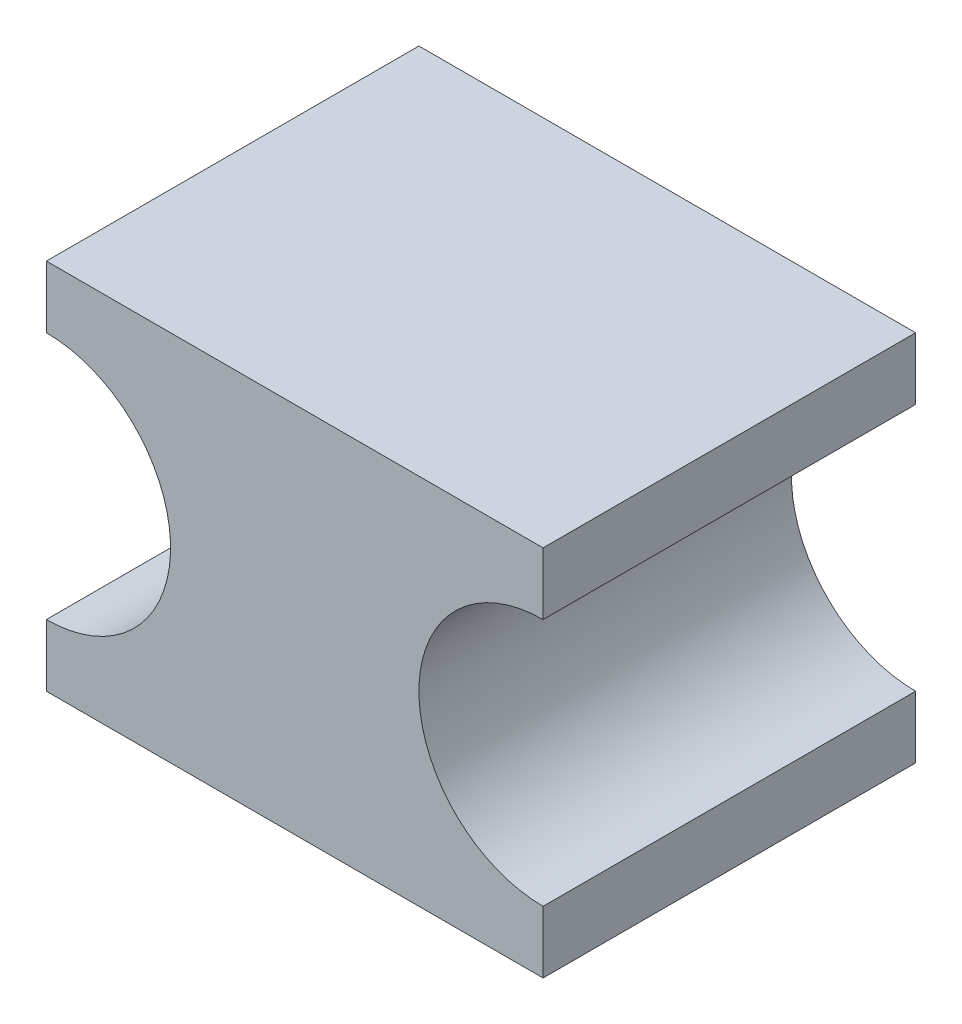
ISO-10303-21;
HEADER;
FILE_DESCRIPTION(('STEP AP214'),'2;1');
FILE_NAME('part.step','',(''),(''),'','','');
FILE_SCHEMA(('AUTOMOTIVE_DESIGN { 1 0 10303 214 1 1 1 1 }'));
ENDSEC;
DATA;
#1=APPLICATION_CONTEXT('core data for automotive mechanical design processes');
#2=APPLICATION_PROTOCOL_DEFINITION('international standard','automotive_design',2000,#1);
#3=PRODUCT_CONTEXT('',#1,'mechanical');
#4=PRODUCT('Part','Part','',(#3));
#5=PRODUCT_RELATED_PRODUCT_CATEGORY('part','',(#4));
#6=PRODUCT_DEFINITION_FORMATION('','',#4);
#7=PRODUCT_DEFINITION_CONTEXT('part definition',#1,'design');
#8=PRODUCT_DEFINITION('design','',#6,#7);
#9=PRODUCT_DEFINITION_SHAPE('','',#8);
#10=(LENGTH_UNIT() NAMED_UNIT(*) SI_UNIT(.MILLI.,.METRE.));
#11=(NAMED_UNIT(*) PLANE_ANGLE_UNIT() SI_UNIT($,.RADIAN.));
#12=(NAMED_UNIT(*) SI_UNIT($,.STERADIAN.) SOLID_ANGLE_UNIT());
#13=UNCERTAINTY_MEASURE_WITH_UNIT(LENGTH_MEASURE(1.E-05),#10,'distance_accuracy_value','');
#14=(GEOMETRIC_REPRESENTATION_CONTEXT(3) GLOBAL_UNCERTAINTY_ASSIGNED_CONTEXT((#13)) GLOBAL_UNIT_ASSIGNED_CONTEXT((#10,
#11,#12)) REPRESENTATION_CONTEXT('',''));
#15=CARTESIAN_POINT('',(0.,0.,0.));
#16=DIRECTION('',(0.,0.,1.));
#17=DIRECTION('',(1.,0.,0.));
#18=AXIS2_PLACEMENT_3D('',#15,#16,#17);
#19=CARTESIAN_POINT('',(0.,38.1,0.));
#20=DIRECTION('',(1.,0.,0.));
#21=DIRECTION('',(0.,0.,-1.));
#22=AXIS2_PLACEMENT_3D('',#19,#20,#21);
#23=PLANE('',#22);
#24=DIRECTION('',(0.,-1.,0.));
#25=VECTOR('',#24,1.);
#26=CARTESIAN_POINT('',(0.,38.1,-38.1));
#27=LINE('',#26,#25);
#28=CARTESIAN_POINT('',(0.,38.1,-38.1));
#29=VERTEX_POINT('',#28);
#30=CARTESIAN_POINT('',(0.,31.75,-38.1));
#31=VERTEX_POINT('',#30);
#32=EDGE_CURVE('E127',#29,#31,#27,.T.);
#33=ORIENTED_EDGE('',*,*,#32,.T.);
#34=DIRECTION('',(0.,0.,1.));
#35=VECTOR('',#34,1.);
#36=CARTESIAN_POINT('',(0.,31.75,-38.1));
#37=LINE('',#36,#35);
#38=CARTESIAN_POINT('',(0.,31.75,0.));
#39=VERTEX_POINT('',#38);
#40=EDGE_CURVE('E60',#31,#39,#37,.T.);
#41=ORIENTED_EDGE('',*,*,#40,.T.);
#42=DIRECTION('',(0.,-1.,0.));
#43=VECTOR('',#42,1.);
#44=CARTESIAN_POINT('',(0.,38.1,0.));
#45=LINE('',#44,#43);
#46=CARTESIAN_POINT('',(0.,38.1,0.));
#47=VERTEX_POINT('',#46);
#48=EDGE_CURVE('E45',#47,#39,#45,.T.);
#49=ORIENTED_EDGE('',*,*,#48,.F.);
#50=DIRECTION('',(0.,0.,1.));
#51=VECTOR('',#50,1.);
#52=CARTESIAN_POINT('',(0.,38.1,0.));
#53=LINE('',#52,#51);
#54=EDGE_CURVE('E162',#29,#47,#53,.T.);
#55=ORIENTED_EDGE('',*,*,#54,.F.);
#56=EDGE_LOOP('',(#33,#41,#49,#55));
#57=FACE_BOUND('',#56,.T.);
#58=ADVANCED_FACE('F37',(#57),#23,.F.);
#59=CARTESIAN_POINT('',(50.8,38.1,0.));
#60=DIRECTION('',(-1.,0.,0.));
#61=DIRECTION('',(0.,0.,1.));
#62=AXIS2_PLACEMENT_3D('',#59,#60,#61);
#63=PLANE('',#62);
#64=DIRECTION('',(0.,-1.,0.));
#65=VECTOR('',#64,1.);
#66=CARTESIAN_POINT('',(50.8,38.1,-38.1));
#67=LINE('',#66,#65);
#68=CARTESIAN_POINT('',(50.8,6.35,-38.1));
#69=VERTEX_POINT('',#68);
#70=CARTESIAN_POINT('',(50.8,0.,-38.1));
#71=VERTEX_POINT('',#70);
#72=EDGE_CURVE('E124',#69,#71,#67,.T.);
#73=ORIENTED_EDGE('',*,*,#72,.F.);
#74=DIRECTION('',(0.,0.,1.));
#75=VECTOR('',#74,1.);
#76=CARTESIAN_POINT('',(50.8,6.35,-38.1));
#77=LINE('',#76,#75);
#78=CARTESIAN_POINT('',(50.8,6.35,0.));
#79=VERTEX_POINT('',#78);
#80=EDGE_CURVE('E52',#69,#79,#77,.T.);
#81=ORIENTED_EDGE('',*,*,#80,.T.);
#82=DIRECTION('',(0.,-1.,0.));
#83=VECTOR('',#82,1.);
#84=CARTESIAN_POINT('',(50.8,38.1,0.));
#85=LINE('',#84,#83);
#86=CARTESIAN_POINT('',(50.8,0.,0.));
#87=VERTEX_POINT('',#86);
#88=EDGE_CURVE('E123',#79,#87,#85,.T.);
#89=ORIENTED_EDGE('',*,*,#88,.T.);
#90=DIRECTION('',(0.,0.,-1.));
#91=VECTOR('',#90,1.);
#92=CARTESIAN_POINT('',(50.8,0.,0.));
#93=LINE('',#92,#91);
#94=EDGE_CURVE('E151',#87,#71,#93,.T.);
#95=ORIENTED_EDGE('',*,*,#94,.T.);
#96=EDGE_LOOP('',(#73,#81,#89,#95));
#97=FACE_BOUND('',#96,.T.);
#98=ADVANCED_FACE('F178',(#97),#63,.F.);
#99=CARTESIAN_POINT('',(0.,6.35000000000001,0.));
#100=VERTEX_POINT('',#99);
#101=CARTESIAN_POINT('',(0.,0.,0.));
#102=VERTEX_POINT('',#101);
#103=EDGE_CURVE('E130',#100,#102,#45,.T.);
#104=ORIENTED_EDGE('',*,*,#103,.F.);
#105=DIRECTION('',(0.,0.,1.));
#106=VECTOR('',#105,1.);
#107=CARTESIAN_POINT('',(0.,6.35000000000001,-38.1));
#108=LINE('',#107,#106);
#109=CARTESIAN_POINT('',(0.,6.35000000000001,-38.1));
#110=VERTEX_POINT('',#109);
#111=EDGE_CURVE('E156',#100,#110,#108,.F.);
#112=ORIENTED_EDGE('',*,*,#111,.T.);
#113=CARTESIAN_POINT('',(0.,0.,-38.1));
#114=VERTEX_POINT('',#113);
#115=EDGE_CURVE('E153',#110,#114,#27,.T.);
#116=ORIENTED_EDGE('',*,*,#115,.T.);
#117=DIRECTION('',(0.,0.,1.));
#118=VECTOR('',#117,1.);
#119=CARTESIAN_POINT('',(0.,0.,0.));
#120=LINE('',#119,#118);
#121=EDGE_CURVE('E149',#114,#102,#120,.T.);
#122=ORIENTED_EDGE('',*,*,#121,.T.);
#123=EDGE_LOOP('',(#104,#112,#116,#122));
#124=FACE_BOUND('',#123,.T.);
#125=ADVANCED_FACE('F39',(#124),#23,.F.);
#126=CARTESIAN_POINT('',(0.,38.1,0.));
#127=DIRECTION('',(0.,0.,-1.));
#128=DIRECTION('',(-1.,0.,0.));
#129=AXIS2_PLACEMENT_3D('',#126,#127,#128);
#130=PLANE('',#129);
#131=ORIENTED_EDGE('',*,*,#48,.T.);
#132=CARTESIAN_POINT('',(0.,19.05,0.));
#133=DIRECTION('',(0.,0.,1.));
#134=DIRECTION('',(1.,0.,0.));
#135=AXIS2_PLACEMENT_3D('',#132,#133,#134);
#136=CIRCLE('',#135,12.7);
#137=EDGE_CURVE('E106',#100,#39,#136,.T.);
#138=ORIENTED_EDGE('',*,*,#137,.F.);
#139=ORIENTED_EDGE('',*,*,#103,.T.);
#140=DIRECTION('',(1.,0.,0.));
#141=VECTOR('',#140,1.);
#142=CARTESIAN_POINT('',(0.,0.,0.));
#143=LINE('',#142,#141);
#144=EDGE_CURVE('E140',#102,#87,#143,.T.);
#145=ORIENTED_EDGE('',*,*,#144,.T.);
#146=ORIENTED_EDGE('',*,*,#88,.F.);
#147=CARTESIAN_POINT('',(50.8,19.05,0.));
#148=DIRECTION('',(0.,0.,1.));
#149=DIRECTION('',(1.,0.,0.));
#150=AXIS2_PLACEMENT_3D('',#147,#148,#149);
#151=CIRCLE('',#150,12.7);
#152=CARTESIAN_POINT('',(50.8,31.75,0.));
#153=VERTEX_POINT('',#152);
#154=EDGE_CURVE('E107',#153,#79,#151,.T.);
#155=ORIENTED_EDGE('',*,*,#154,.F.);
#156=CARTESIAN_POINT('',(50.8,38.1,0.));
#157=VERTEX_POINT('',#156);
#158=EDGE_CURVE('E117',#157,#153,#85,.T.);
#159=ORIENTED_EDGE('',*,*,#158,.F.);
#160=DIRECTION('',(1.,0.,0.));
#161=VECTOR('',#160,1.);
#162=CARTESIAN_POINT('',(0.,38.1,0.));
#163=LINE('',#162,#161);
#164=EDGE_CURVE('E164',#47,#157,#163,.T.);
#165=ORIENTED_EDGE('',*,*,#164,.F.);
#166=EDGE_LOOP('',(#131,#138,#139,#145,#146,#155,#159,#165));
#167=FACE_BOUND('',#166,.T.);
#168=ADVANCED_FACE('F138',(#167),#130,.F.);
#169=ORIENTED_EDGE('',*,*,#158,.T.);
#170=DIRECTION('',(0.,0.,1.));
#171=VECTOR('',#170,1.);
#172=CARTESIAN_POINT('',(50.8,31.75,-38.1));
#173=LINE('',#172,#171);
#174=CARTESIAN_POINT('',(50.8,31.75,-38.1));
#175=VERTEX_POINT('',#174);
#176=EDGE_CURVE('E101',#153,#175,#173,.F.);
#177=ORIENTED_EDGE('',*,*,#176,.T.);
#178=CARTESIAN_POINT('',(50.8,38.1,-38.1));
#179=VERTEX_POINT('',#178);
#180=EDGE_CURVE('E114',#179,#175,#67,.T.);
#181=ORIENTED_EDGE('',*,*,#180,.F.);
#182=DIRECTION('',(0.,0.,-1.));
#183=VECTOR('',#182,1.);
#184=CARTESIAN_POINT('',(50.8,38.1,0.));
#185=LINE('',#184,#183);
#186=EDGE_CURVE('E168',#157,#179,#185,.T.);
#187=ORIENTED_EDGE('',*,*,#186,.F.);
#188=EDGE_LOOP('',(#169,#177,#181,#187));
#189=FACE_BOUND('',#188,.T.);
#190=ADVANCED_FACE('F112',(#189),#63,.F.);
#191=CARTESIAN_POINT('',(0.,38.1,-38.1));
#192=DIRECTION('',(0.,0.,1.));
#193=DIRECTION('',(1.,0.,0.));
#194=AXIS2_PLACEMENT_3D('',#191,#192,#193);
#195=PLANE('',#194);
#196=ORIENTED_EDGE('',*,*,#115,.F.);
#197=CARTESIAN_POINT('',(0.,19.05,-38.1));
#198=DIRECTION('',(0.,0.,1.));
#199=DIRECTION('',(1.,0.,0.));
#200=AXIS2_PLACEMENT_3D('',#197,#198,#199);
#201=CIRCLE('',#200,12.7);
#202=EDGE_CURVE('E11',#110,#31,#201,.T.);
#203=ORIENTED_EDGE('',*,*,#202,.T.);
#204=ORIENTED_EDGE('',*,*,#32,.F.);
#205=DIRECTION('',(-1.,0.,0.));
#206=VECTOR('',#205,1.);
#207=CARTESIAN_POINT('',(0.,38.1,-38.1));
#208=LINE('',#207,#206);
#209=EDGE_CURVE('E122',#179,#29,#208,.T.);
#210=ORIENTED_EDGE('',*,*,#209,.F.);
#211=ORIENTED_EDGE('',*,*,#180,.T.);
#212=CARTESIAN_POINT('',(50.8,19.05,-38.1));
#213=DIRECTION('',(0.,0.,1.));
#214=DIRECTION('',(1.,0.,0.));
#215=AXIS2_PLACEMENT_3D('',#212,#213,#214);
#216=CIRCLE('',#215,12.7);
#217=EDGE_CURVE('E98',#175,#69,#216,.T.);
#218=ORIENTED_EDGE('',*,*,#217,.T.);
#219=ORIENTED_EDGE('',*,*,#72,.T.);
#220=DIRECTION('',(-1.,0.,0.));
#221=VECTOR('',#220,1.);
#222=CARTESIAN_POINT('',(0.,0.,-38.1));
#223=LINE('',#222,#221);
#224=EDGE_CURVE('E161',#71,#114,#223,.T.);
#225=ORIENTED_EDGE('',*,*,#224,.T.);
#226=EDGE_LOOP('',(#196,#203,#204,#210,#211,#218,#219,#225));
#227=FACE_BOUND('',#226,.T.);
#228=ADVANCED_FACE('F120',(#227),#195,.F.);
#229=CARTESIAN_POINT('',(0.,38.1,0.));
#230=DIRECTION('',(0.,-1.,0.));
#231=DIRECTION('',(0.,0.,-1.));
#232=AXIS2_PLACEMENT_3D('',#229,#230,#231);
#233=PLANE('',#232);
#234=ORIENTED_EDGE('',*,*,#54,.T.);
#235=ORIENTED_EDGE('',*,*,#164,.T.);
#236=ORIENTED_EDGE('',*,*,#186,.T.);
#237=ORIENTED_EDGE('',*,*,#209,.T.);
#238=EDGE_LOOP('',(#234,#235,#236,#237));
#239=FACE_BOUND('',#238,.T.);
#240=ADVANCED_FACE('F191',(#239),#233,.F.);
#241=CARTESIAN_POINT('',(0.,0.,0.));
#242=DIRECTION('',(0.,-1.,0.));
#243=DIRECTION('',(0.,0.,-1.));
#244=AXIS2_PLACEMENT_3D('',#241,#242,#243);
#245=PLANE('',#244);
#246=ORIENTED_EDGE('',*,*,#121,.F.);
#247=ORIENTED_EDGE('',*,*,#224,.F.);
#248=ORIENTED_EDGE('',*,*,#94,.F.);
#249=ORIENTED_EDGE('',*,*,#144,.F.);
#250=EDGE_LOOP('',(#246,#247,#248,#249));
#251=FACE_BOUND('',#250,.T.);
#252=ADVANCED_FACE('F147',(#251),#245,.T.);
#253=CARTESIAN_POINT('',(50.8,19.05,-38.1));
#254=DIRECTION('',(0.,0.,1.));
#255=DIRECTION('',(1.,0.,0.));
#256=AXIS2_PLACEMENT_3D('',#253,#254,#255);
#257=CYLINDRICAL_SURFACE('',#256,12.7);
#258=ORIENTED_EDGE('',*,*,#217,.F.);
#259=ORIENTED_EDGE('',*,*,#176,.F.);
#260=ORIENTED_EDGE('',*,*,#154,.T.);
#261=ORIENTED_EDGE('',*,*,#80,.F.);
#262=EDGE_LOOP('',(#258,#259,#260,#261));
#263=FACE_BOUND('',#262,.T.);
#264=ADVANCED_FACE('F100',(#263),#257,.F.);
#265=CARTESIAN_POINT('',(0.,19.05,-38.1));
#266=DIRECTION('',(0.,0.,1.));
#267=DIRECTION('',(1.,0.,0.));
#268=AXIS2_PLACEMENT_3D('',#265,#266,#267);
#269=CYLINDRICAL_SURFACE('',#268,12.7);
#270=ORIENTED_EDGE('',*,*,#202,.F.);
#271=ORIENTED_EDGE('',*,*,#111,.F.);
#272=ORIENTED_EDGE('',*,*,#137,.T.);
#273=ORIENTED_EDGE('',*,*,#40,.F.);
#274=EDGE_LOOP('',(#270,#271,#272,#273));
#275=FACE_BOUND('',#274,.T.);
#276=ADVANCED_FACE('F173',(#275),#269,.F.);
#277=CLOSED_SHELL('',(#58,#98,#125,#168,#190,#228,#240,#252,#264,#276));
#278=MANIFOLD_SOLID_BREP('B2',#277);
#279=ADVANCED_BREP_SHAPE_REPRESENTATION('',(#18,#278),#14);
#280=SHAPE_DEFINITION_REPRESENTATION(#9,#279);
ENDSEC;
END-ISO-10303-21;
